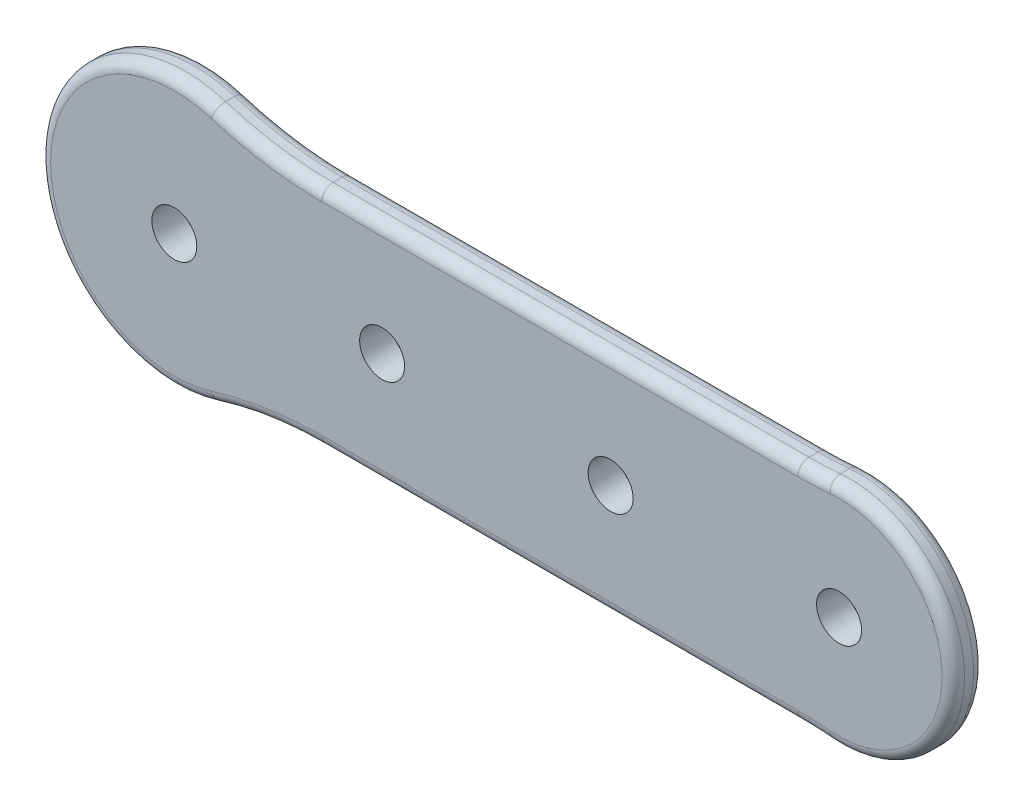
ISO-10303-21;
HEADER;
FILE_DESCRIPTION(('STEP AP214'),'2;1');
FILE_NAME('part.step','',(''),(''),'','','');
FILE_SCHEMA(('AUTOMOTIVE_DESIGN { 1 0 10303 214 1 1 1 1 }'));
ENDSEC;
DATA;
#1=APPLICATION_CONTEXT('core data for automotive mechanical design processes');
#2=APPLICATION_PROTOCOL_DEFINITION('international standard','automotive_design',2000,#1);
#3=PRODUCT_CONTEXT('',#1,'mechanical');
#4=PRODUCT('Part','Part','',(#3));
#5=PRODUCT_RELATED_PRODUCT_CATEGORY('part','',(#4));
#6=PRODUCT_DEFINITION_FORMATION('','',#4);
#7=PRODUCT_DEFINITION_CONTEXT('part definition',#1,'design');
#8=PRODUCT_DEFINITION('design','',#6,#7);
#9=PRODUCT_DEFINITION_SHAPE('','',#8);
#10=(LENGTH_UNIT() NAMED_UNIT(*) SI_UNIT(.MILLI.,.METRE.));
#11=(NAMED_UNIT(*) PLANE_ANGLE_UNIT() SI_UNIT($,.RADIAN.));
#12=(NAMED_UNIT(*) SI_UNIT($,.STERADIAN.) SOLID_ANGLE_UNIT());
#13=UNCERTAINTY_MEASURE_WITH_UNIT(LENGTH_MEASURE(1.E-05),#10,'distance_accuracy_value','');
#14=(GEOMETRIC_REPRESENTATION_CONTEXT(3) GLOBAL_UNCERTAINTY_ASSIGNED_CONTEXT((#13)) GLOBAL_UNIT_ASSIGNED_CONTEXT((#10,
#11,#12)) REPRESENTATION_CONTEXT('',''));
#15=CARTESIAN_POINT('',(0.,0.,0.));
#16=DIRECTION('',(0.,0.,1.));
#17=DIRECTION('',(1.,0.,0.));
#18=AXIS2_PLACEMENT_3D('',#15,#16,#17);
#19=CARTESIAN_POINT('',(-73.9,0.,7.));
#20=DIRECTION('',(0.,0.,-1.));
#21=DIRECTION('',(-1.,0.,0.));
#22=AXIS2_PLACEMENT_3D('',#19,#20,#21);
#23=CYLINDRICAL_SURFACE('',#22,30.);
#24=DIRECTION('',(0.,0.,-1.));
#25=VECTOR('',#24,1.);
#26=CARTESIAN_POINT('',(-64.9580383759518,-28.6363636363636,7.));
#27=LINE('',#26,#25);
#28=CARTESIAN_POINT('',(-64.9580383759518,-28.6363636363636,2.5));
#29=VERTEX_POINT('',#28);
#30=CARTESIAN_POINT('',(-64.9580383759518,-28.6363636363636,4.5));
#31=VERTEX_POINT('',#30);
#32=EDGE_CURVE('E191',#29,#31,#27,.F.);
#33=ORIENTED_EDGE('',*,*,#32,.T.);
#34=CARTESIAN_POINT('',(-73.9,0.,4.5));
#35=DIRECTION('',(0.,0.,1.));
#36=DIRECTION('',(1.,0.,0.));
#37=AXIS2_PLACEMENT_3D('',#34,#35,#36);
#38=CIRCLE('',#37,30.);
#39=CARTESIAN_POINT('',(-64.9580383759518,28.6363636363636,4.5));
#40=VERTEX_POINT('',#39);
#41=EDGE_CURVE('E228',#31,#40,#38,.F.);
#42=ORIENTED_EDGE('',*,*,#41,.T.);
#43=DIRECTION('',(0.,0.,-1.));
#44=VECTOR('',#43,1.);
#45=CARTESIAN_POINT('',(-64.9580383759518,28.6363636363636,7.));
#46=LINE('',#45,#44);
#47=CARTESIAN_POINT('',(-64.9580383759518,28.6363636363636,2.5));
#48=VERTEX_POINT('',#47);
#49=EDGE_CURVE('E196',#40,#48,#46,.T.);
#50=ORIENTED_EDGE('',*,*,#49,.T.);
#51=CARTESIAN_POINT('',(-73.9,0.,2.5));
#52=DIRECTION('',(0.,0.,1.));
#53=DIRECTION('',(1.,0.,0.));
#54=AXIS2_PLACEMENT_3D('',#51,#52,#53);
#55=CIRCLE('',#54,30.);
#56=EDGE_CURVE('E225',#48,#29,#55,.T.);
#57=ORIENTED_EDGE('',*,*,#56,.T.);
#58=EDGE_LOOP('',(#33,#42,#50,#57));
#59=FACE_BOUND('',#58,.T.);
#60=ADVANCED_FACE('F47',(#59),#23,.T.);
#61=CARTESIAN_POINT('',(0.,-25.,7.));
#62=DIRECTION('',(0.,1.,0.));
#63=DIRECTION('',(0.,0.,1.));
#64=AXIS2_PLACEMENT_3D('',#61,#62,#63);
#65=PLANE('',#64);
#66=DIRECTION('',(0.,0.,1.));
#67=VECTOR('',#66,1.);
#68=CARTESIAN_POINT('',(64.7261240470564,-25.,7.));
#69=LINE('',#68,#67);
#70=CARTESIAN_POINT('',(64.7261240470564,-25.,2.5));
#71=VERTEX_POINT('',#70);
#72=CARTESIAN_POINT('',(64.7261240470564,-25.,4.5));
#73=VERTEX_POINT('',#72);
#74=EDGE_CURVE('E356',#71,#73,#69,.T.);
#75=ORIENTED_EDGE('',*,*,#74,.T.);
#76=DIRECTION('',(1.,0.,0.));
#77=VECTOR('',#76,1.);
#78=CARTESIAN_POINT('',(-41.11280737849,-25.,4.5));
#79=LINE('',#78,#77);
#80=CARTESIAN_POINT('',(-41.11280737849,-25.,4.5));
#81=VERTEX_POINT('',#80);
#82=EDGE_CURVE('E240',#73,#81,#79,.F.);
#83=ORIENTED_EDGE('',*,*,#82,.T.);
#84=DIRECTION('',(0.,0.,1.));
#85=VECTOR('',#84,1.);
#86=CARTESIAN_POINT('',(-41.11280737849,-25.,0.));
#87=LINE('',#86,#85);
#88=CARTESIAN_POINT('',(-41.11280737849,-25.,2.5));
#89=VERTEX_POINT('',#88);
#90=EDGE_CURVE('E363',#81,#89,#87,.F.);
#91=ORIENTED_EDGE('',*,*,#90,.T.);
#92=DIRECTION('',(1.,0.,0.));
#93=VECTOR('',#92,1.);
#94=CARTESIAN_POINT('',(0.,-25.,2.5));
#95=LINE('',#94,#93);
#96=EDGE_CURVE('E237',#89,#71,#95,.T.);
#97=ORIENTED_EDGE('',*,*,#96,.T.);
#98=EDGE_LOOP('',(#75,#83,#91,#97));
#99=FACE_BOUND('',#98,.T.);
#100=ADVANCED_FACE('F429',(#99),#65,.F.);
#101=CARTESIAN_POINT('',(73.9,0.,7.));
#102=DIRECTION('',(0.,0.,-1.));
#103=DIRECTION('',(-1.,0.,0.));
#104=AXIS2_PLACEMENT_3D('',#101,#102,#103);
#105=CYLINDRICAL_SURFACE('',#104,25.4);
#106=DIRECTION('',(0.,0.,-1.));
#107=VECTOR('',#106,1.);
#108=CARTESIAN_POINT('',(71.6892177494804,25.303605313093,7.));
#109=LINE('',#108,#107);
#110=CARTESIAN_POINT('',(71.6892177494804,25.303605313093,2.5));
#111=VERTEX_POINT('',#110);
#112=CARTESIAN_POINT('',(71.6892177494804,25.303605313093,4.5));
#113=VERTEX_POINT('',#112);
#114=EDGE_CURVE('E364',#111,#113,#109,.F.);
#115=ORIENTED_EDGE('',*,*,#114,.T.);
#116=CARTESIAN_POINT('',(73.9,0.,4.5));
#117=DIRECTION('',(0.,0.,1.));
#118=DIRECTION('',(1.,0.,0.));
#119=AXIS2_PLACEMENT_3D('',#116,#117,#118);
#120=CIRCLE('',#119,25.4);
#121=CARTESIAN_POINT('',(71.6892177494804,-25.303605313093,4.5));
#122=VERTEX_POINT('',#121);
#123=EDGE_CURVE('E252',#113,#122,#120,.F.);
#124=ORIENTED_EDGE('',*,*,#123,.T.);
#125=DIRECTION('',(0.,0.,-1.));
#126=VECTOR('',#125,1.);
#127=CARTESIAN_POINT('',(71.6892177494804,-25.303605313093,7.));
#128=LINE('',#127,#126);
#129=CARTESIAN_POINT('',(71.6892177494804,-25.303605313093,2.5));
#130=VERTEX_POINT('',#129);
#131=EDGE_CURVE('E353',#122,#130,#128,.T.);
#132=ORIENTED_EDGE('',*,*,#131,.T.);
#133=CARTESIAN_POINT('',(73.9,0.,2.5));
#134=DIRECTION('',(0.,0.,1.));
#135=DIRECTION('',(1.,0.,0.));
#136=AXIS2_PLACEMENT_3D('',#133,#134,#135);
#137=CIRCLE('',#136,25.4);
#138=EDGE_CURVE('E249',#130,#111,#137,.T.);
#139=ORIENTED_EDGE('',*,*,#138,.T.);
#140=EDGE_LOOP('',(#115,#124,#132,#139));
#141=FACE_BOUND('',#140,.T.);
#142=ADVANCED_FACE('F359',(#141),#105,.T.);
#143=CARTESIAN_POINT('',(-27.7,0.,7.));
#144=DIRECTION('',(0.,0.,-1.));
#145=DIRECTION('',(-1.,0.,0.));
#146=AXIS2_PLACEMENT_3D('',#143,#144,#145);
#147=CYLINDRICAL_SURFACE('',#146,5.);
#148=CARTESIAN_POINT('',(-27.7,0.,7.));
#149=DIRECTION('',(0.,0.,1.));
#150=DIRECTION('',(1.,0.,0.));
#151=AXIS2_PLACEMENT_3D('',#148,#149,#150);
#152=CIRCLE('',#151,5.);
#153=CARTESIAN_POINT('',(-22.7,0.,7.));
#154=VERTEX_POINT('',#153);
#155=EDGE_CURVE('E721',#154,#154,#152,.T.);
#156=ORIENTED_EDGE('',*,*,#155,.T.);
#157=EDGE_LOOP('',(#156));
#158=FACE_BOUND('',#157,.T.);
#159=CARTESIAN_POINT('',(-27.7,0.,0.));
#160=DIRECTION('',(0.,0.,1.));
#161=DIRECTION('',(1.,0.,0.));
#162=AXIS2_PLACEMENT_3D('',#159,#160,#161);
#163=CIRCLE('',#162,5.);
#164=CARTESIAN_POINT('',(-22.7,0.,0.));
#165=VERTEX_POINT('',#164);
#166=EDGE_CURVE('E724',#165,#165,#163,.T.);
#167=ORIENTED_EDGE('',*,*,#166,.F.);
#168=EDGE_LOOP('',(#167));
#169=FACE_BOUND('',#168,.T.);
#170=ADVANCED_FACE('F657',(#158,#169),#147,.F.);
#171=CARTESIAN_POINT('',(-73.9,0.,7.));
#172=DIRECTION('',(0.,0.,-1.));
#173=DIRECTION('',(-1.,0.,0.));
#174=AXIS2_PLACEMENT_3D('',#171,#172,#173);
#175=CYLINDRICAL_SURFACE('',#174,5.);
#176=CARTESIAN_POINT('',(-73.9,0.,7.));
#177=DIRECTION('',(0.,0.,1.));
#178=DIRECTION('',(1.,0.,0.));
#179=AXIS2_PLACEMENT_3D('',#176,#177,#178);
#180=CIRCLE('',#179,5.);
#181=CARTESIAN_POINT('',(-68.9,0.,7.));
#182=VERTEX_POINT('',#181);
#183=EDGE_CURVE('E746',#182,#182,#180,.T.);
#184=ORIENTED_EDGE('',*,*,#183,.T.);
#185=EDGE_LOOP('',(#184));
#186=FACE_BOUND('',#185,.T.);
#187=CARTESIAN_POINT('',(-73.9,0.,0.));
#188=DIRECTION('',(0.,0.,1.));
#189=DIRECTION('',(1.,0.,0.));
#190=AXIS2_PLACEMENT_3D('',#187,#188,#189);
#191=CIRCLE('',#190,5.);
#192=CARTESIAN_POINT('',(-68.9,0.,0.));
#193=VERTEX_POINT('',#192);
#194=EDGE_CURVE('E728',#193,#193,#191,.T.);
#195=ORIENTED_EDGE('',*,*,#194,.F.);
#196=EDGE_LOOP('',(#195));
#197=FACE_BOUND('',#196,.T.);
#198=ADVANCED_FACE('F648',(#186,#197),#175,.F.);
#199=CARTESIAN_POINT('',(0.,25.,7.));
#200=DIRECTION('',(0.,1.,0.));
#201=DIRECTION('',(0.,0.,1.));
#202=AXIS2_PLACEMENT_3D('',#199,#200,#201);
#203=PLANE('',#202);
#204=DIRECTION('',(0.,0.,-1.));
#205=VECTOR('',#204,1.);
#206=CARTESIAN_POINT('',(-41.11280737849,25.,7.));
#207=LINE('',#206,#205);
#208=CARTESIAN_POINT('',(-41.11280737849,25.,2.5));
#209=VERTEX_POINT('',#208);
#210=CARTESIAN_POINT('',(-41.11280737849,25.,4.5));
#211=VERTEX_POINT('',#210);
#212=EDGE_CURVE('E377',#209,#211,#207,.F.);
#213=ORIENTED_EDGE('',*,*,#212,.T.);
#214=DIRECTION('',(1.,0.,0.));
#215=VECTOR('',#214,1.);
#216=CARTESIAN_POINT('',(0.,25.,4.5));
#217=LINE('',#216,#215);
#218=CARTESIAN_POINT('',(64.7261240470564,25.,4.5));
#219=VERTEX_POINT('',#218);
#220=EDGE_CURVE('E11',#211,#219,#217,.T.);
#221=ORIENTED_EDGE('',*,*,#220,.T.);
#222=DIRECTION('',(0.,0.,-1.));
#223=VECTOR('',#222,1.);
#224=CARTESIAN_POINT('',(64.7261240470564,25.,7.));
#225=LINE('',#224,#223);
#226=CARTESIAN_POINT('',(64.7261240470564,25.,2.5));
#227=VERTEX_POINT('',#226);
#228=EDGE_CURVE('E381',#219,#227,#225,.T.);
#229=ORIENTED_EDGE('',*,*,#228,.T.);
#230=DIRECTION('',(1.,0.,0.));
#231=VECTOR('',#230,1.);
#232=CARTESIAN_POINT('',(-41.11280737849,25.,2.5));
#233=LINE('',#232,#231);
#234=EDGE_CURVE('E57',#227,#209,#233,.F.);
#235=ORIENTED_EDGE('',*,*,#234,.T.);
#236=EDGE_LOOP('',(#213,#221,#229,#235));
#237=FACE_BOUND('',#236,.T.);
#238=ADVANCED_FACE('F443',(#237),#203,.T.);
#239=CARTESIAN_POINT('',(73.9,0.,7.));
#240=DIRECTION('',(0.,0.,-1.));
#241=DIRECTION('',(-1.,0.,0.));
#242=AXIS2_PLACEMENT_3D('',#239,#240,#241);
#243=CYLINDRICAL_SURFACE('',#242,5.);
#244=CARTESIAN_POINT('',(73.9,0.,7.));
#245=DIRECTION('',(0.,0.,1.));
#246=DIRECTION('',(1.,0.,0.));
#247=AXIS2_PLACEMENT_3D('',#244,#245,#246);
#248=CIRCLE('',#247,5.);
#249=CARTESIAN_POINT('',(78.9,0.,7.));
#250=VERTEX_POINT('',#249);
#251=EDGE_CURVE('E734',#250,#250,#248,.T.);
#252=ORIENTED_EDGE('',*,*,#251,.T.);
#253=EDGE_LOOP('',(#252));
#254=FACE_BOUND('',#253,.T.);
#255=CARTESIAN_POINT('',(73.9,0.,0.));
#256=DIRECTION('',(0.,0.,1.));
#257=DIRECTION('',(1.,0.,0.));
#258=AXIS2_PLACEMENT_3D('',#255,#256,#257);
#259=CIRCLE('',#258,5.);
#260=CARTESIAN_POINT('',(78.9,0.,0.));
#261=VERTEX_POINT('',#260);
#262=EDGE_CURVE('E306',#261,#261,#259,.T.);
#263=ORIENTED_EDGE('',*,*,#262,.F.);
#264=EDGE_LOOP('',(#263));
#265=FACE_BOUND('',#264,.T.);
#266=ADVANCED_FACE('F439',(#254,#265),#243,.F.);
#267=CARTESIAN_POINT('',(23.1,0.,7.));
#268=DIRECTION('',(0.,0.,-1.));
#269=DIRECTION('',(-1.,0.,0.));
#270=AXIS2_PLACEMENT_3D('',#267,#268,#269);
#271=CYLINDRICAL_SURFACE('',#270,5.);
#272=CARTESIAN_POINT('',(23.1,0.,7.));
#273=DIRECTION('',(0.,0.,1.));
#274=DIRECTION('',(1.,0.,0.));
#275=AXIS2_PLACEMENT_3D('',#272,#273,#274);
#276=CIRCLE('',#275,5.);
#277=CARTESIAN_POINT('',(28.1,0.,7.));
#278=VERTEX_POINT('',#277);
#279=EDGE_CURVE('E371',#278,#278,#276,.T.);
#280=ORIENTED_EDGE('',*,*,#279,.T.);
#281=EDGE_LOOP('',(#280));
#282=FACE_BOUND('',#281,.T.);
#283=CARTESIAN_POINT('',(23.1,0.,0.));
#284=DIRECTION('',(0.,0.,1.));
#285=DIRECTION('',(1.,0.,0.));
#286=AXIS2_PLACEMENT_3D('',#283,#284,#285);
#287=CIRCLE('',#286,5.);
#288=CARTESIAN_POINT('',(28.1,0.,0.));
#289=VERTEX_POINT('',#288);
#290=EDGE_CURVE('E727',#289,#289,#287,.T.);
#291=ORIENTED_EDGE('',*,*,#290,.F.);
#292=EDGE_LOOP('',(#291));
#293=FACE_BOUND('',#292,.T.);
#294=ADVANCED_FACE('F442',(#282,#293),#271,.F.);
#295=CARTESIAN_POINT('',(0.,0.,7.));
#296=DIRECTION('',(0.,0.,1.));
#297=DIRECTION('',(1.,0.,0.));
#298=AXIS2_PLACEMENT_3D('',#295,#296,#297);
#299=PLANE('',#298);
#300=DIRECTION('',(1.,0.,0.));
#301=VECTOR('',#300,1.);
#302=CARTESIAN_POINT('',(0.,22.5,7.));
#303=LINE('',#302,#301);
#304=CARTESIAN_POINT('',(64.7261240470564,22.5,7.));
#305=VERTEX_POINT('',#304);
#306=CARTESIAN_POINT('',(-41.11280737849,22.5,7.));
#307=VERTEX_POINT('',#306);
#308=EDGE_CURVE('E167',#305,#307,#303,.F.);
#309=ORIENTED_EDGE('',*,*,#308,.T.);
#310=CARTESIAN_POINT('',(-41.11280737849,105.,7.));
#311=DIRECTION('',(0.,0.,1.));
#312=DIRECTION('',(1.,0.,0.));
#313=AXIS2_PLACEMENT_3D('',#310,#311,#312);
#314=CIRCLE('',#313,82.5);
#315=CARTESIAN_POINT('',(-65.7032018446225,26.25,7.));
#316=VERTEX_POINT('',#315);
#317=EDGE_CURVE('E214',#307,#316,#314,.F.);
#318=ORIENTED_EDGE('',*,*,#317,.T.);
#319=CARTESIAN_POINT('',(-73.9,0.,7.));
#320=DIRECTION('',(0.,0.,1.));
#321=DIRECTION('',(1.,0.,0.));
#322=AXIS2_PLACEMENT_3D('',#319,#320,#321);
#323=CIRCLE('',#322,27.5);
#324=CARTESIAN_POINT('',(-65.7032018446225,-26.25,7.));
#325=VERTEX_POINT('',#324);
#326=EDGE_CURVE('E211',#316,#325,#323,.T.);
#327=ORIENTED_EDGE('',*,*,#326,.T.);
#328=CARTESIAN_POINT('',(-41.11280737849,-105.,7.));
#329=DIRECTION('',(0.,0.,1.));
#330=DIRECTION('',(1.,0.,0.));
#331=AXIS2_PLACEMENT_3D('',#328,#329,#330);
#332=CIRCLE('',#331,82.5);
#333=CARTESIAN_POINT('',(-41.11280737849,-22.5,7.));
#334=VERTEX_POINT('',#333);
#335=EDGE_CURVE('E208',#325,#334,#332,.F.);
#336=ORIENTED_EDGE('',*,*,#335,.T.);
#337=DIRECTION('',(1.,0.,0.));
#338=VECTOR('',#337,1.);
#339=CARTESIAN_POINT('',(64.7261240470564,-22.5,7.));
#340=LINE('',#339,#338);
#341=CARTESIAN_POINT('',(64.7261240470564,-22.5,7.));
#342=VERTEX_POINT('',#341);
#343=EDGE_CURVE('E205',#334,#342,#340,.T.);
#344=ORIENTED_EDGE('',*,*,#343,.T.);
#345=CARTESIAN_POINT('',(64.7261240470564,-105.,7.));
#346=DIRECTION('',(0.,0.,1.));
#347=DIRECTION('',(1.,0.,0.));
#348=AXIS2_PLACEMENT_3D('',#345,#346,#347);
#349=CIRCLE('',#348,82.5);
#350=CARTESIAN_POINT('',(71.9068144276811,-22.8130929791271,7.));
#351=VERTEX_POINT('',#350);
#352=EDGE_CURVE('E202',#342,#351,#349,.F.);
#353=ORIENTED_EDGE('',*,*,#352,.T.);
#354=CARTESIAN_POINT('',(73.9,0.,7.));
#355=DIRECTION('',(0.,0.,1.));
#356=DIRECTION('',(1.,0.,0.));
#357=AXIS2_PLACEMENT_3D('',#354,#355,#356);
#358=CIRCLE('',#357,22.9);
#359=CARTESIAN_POINT('',(71.9068144276811,22.8130929791271,7.));
#360=VERTEX_POINT('',#359);
#361=EDGE_CURVE('E170',#351,#360,#358,.T.);
#362=ORIENTED_EDGE('',*,*,#361,.T.);
#363=CARTESIAN_POINT('',(64.7261240470564,105.,7.));
#364=DIRECTION('',(0.,0.,1.));
#365=DIRECTION('',(1.,0.,0.));
#366=AXIS2_PLACEMENT_3D('',#363,#364,#365);
#367=CIRCLE('',#366,82.5);
#368=EDGE_CURVE('E161',#360,#305,#367,.F.);
#369=ORIENTED_EDGE('',*,*,#368,.T.);
#370=EDGE_LOOP('',(#309,#318,#327,#336,#344,#353,#362,#369));
#371=FACE_BOUND('',#370,.T.);
#372=ORIENTED_EDGE('',*,*,#251,.F.);
#373=EDGE_LOOP('',(#372));
#374=FACE_BOUND('',#373,.T.);
#375=ORIENTED_EDGE('',*,*,#183,.F.);
#376=EDGE_LOOP('',(#375));
#377=FACE_BOUND('',#376,.T.);
#378=ORIENTED_EDGE('',*,*,#155,.F.);
#379=EDGE_LOOP('',(#378));
#380=FACE_BOUND('',#379,.T.);
#381=ORIENTED_EDGE('',*,*,#279,.F.);
#382=EDGE_LOOP('',(#381));
#383=FACE_BOUND('',#382,.T.);
#384=ADVANCED_FACE('F163',(#371,#374,#377,#380,#383),#299,.T.);
#385=CARTESIAN_POINT('',(0.,0.,0.));
#386=DIRECTION('',(0.,0.,1.));
#387=DIRECTION('',(1.,0.,0.));
#388=AXIS2_PLACEMENT_3D('',#385,#386,#387);
#389=PLANE('',#388);
#390=CARTESIAN_POINT('',(-73.9,0.,0.));
#391=DIRECTION('',(0.,0.,1.));
#392=DIRECTION('',(1.,0.,0.));
#393=AXIS2_PLACEMENT_3D('',#390,#391,#392);
#394=CIRCLE('',#393,27.5);
#395=CARTESIAN_POINT('',(-65.7032018446225,-26.25,0.));
#396=VERTEX_POINT('',#395);
#397=CARTESIAN_POINT('',(-65.7032018446225,26.25,0.));
#398=VERTEX_POINT('',#397);
#399=EDGE_CURVE('E65',#396,#398,#394,.F.);
#400=ORIENTED_EDGE('',*,*,#399,.T.);
#401=CARTESIAN_POINT('',(-41.11280737849,105.,0.));
#402=DIRECTION('',(0.,0.,1.));
#403=DIRECTION('',(1.,0.,0.));
#404=AXIS2_PLACEMENT_3D('',#401,#402,#403);
#405=CIRCLE('',#404,82.5);
#406=CARTESIAN_POINT('',(-41.11280737849,22.5,0.));
#407=VERTEX_POINT('',#406);
#408=EDGE_CURVE('E279',#398,#407,#405,.T.);
#409=ORIENTED_EDGE('',*,*,#408,.T.);
#410=DIRECTION('',(1.,0.,0.));
#411=VECTOR('',#410,1.);
#412=CARTESIAN_POINT('',(64.7261240470564,22.5,0.));
#413=LINE('',#412,#411);
#414=CARTESIAN_POINT('',(64.7261240470564,22.5,0.));
#415=VERTEX_POINT('',#414);
#416=EDGE_CURVE('E260',#407,#415,#413,.T.);
#417=ORIENTED_EDGE('',*,*,#416,.T.);
#418=CARTESIAN_POINT('',(64.7261240470564,105.,0.));
#419=DIRECTION('',(0.,0.,1.));
#420=DIRECTION('',(1.,0.,0.));
#421=AXIS2_PLACEMENT_3D('',#418,#419,#420);
#422=CIRCLE('',#421,82.5);
#423=CARTESIAN_POINT('',(71.9068144276811,22.8130929791271,0.));
#424=VERTEX_POINT('',#423);
#425=EDGE_CURVE('E263',#415,#424,#422,.T.);
#426=ORIENTED_EDGE('',*,*,#425,.T.);
#427=CARTESIAN_POINT('',(73.9,0.,0.));
#428=DIRECTION('',(0.,0.,1.));
#429=DIRECTION('',(1.,0.,0.));
#430=AXIS2_PLACEMENT_3D('',#427,#428,#429);
#431=CIRCLE('',#430,22.9);
#432=CARTESIAN_POINT('',(71.9068144276811,-22.8130929791271,0.));
#433=VERTEX_POINT('',#432);
#434=EDGE_CURVE('E266',#424,#433,#431,.F.);
#435=ORIENTED_EDGE('',*,*,#434,.T.);
#436=CARTESIAN_POINT('',(64.7261240470564,-105.,0.));
#437=DIRECTION('',(0.,0.,1.));
#438=DIRECTION('',(1.,0.,0.));
#439=AXIS2_PLACEMENT_3D('',#436,#437,#438);
#440=CIRCLE('',#439,82.5);
#441=CARTESIAN_POINT('',(64.7261240470564,-22.5,0.));
#442=VERTEX_POINT('',#441);
#443=EDGE_CURVE('E269',#433,#442,#440,.T.);
#444=ORIENTED_EDGE('',*,*,#443,.T.);
#445=DIRECTION('',(1.,0.,0.));
#446=VECTOR('',#445,1.);
#447=CARTESIAN_POINT('',(0.,-22.5,0.));
#448=LINE('',#447,#446);
#449=CARTESIAN_POINT('',(-41.11280737849,-22.5,0.));
#450=VERTEX_POINT('',#449);
#451=EDGE_CURVE('E272',#442,#450,#448,.F.);
#452=ORIENTED_EDGE('',*,*,#451,.T.);
#453=CARTESIAN_POINT('',(-41.11280737849,-105.,0.));
#454=DIRECTION('',(0.,0.,1.));
#455=DIRECTION('',(1.,0.,0.));
#456=AXIS2_PLACEMENT_3D('',#453,#454,#455);
#457=CIRCLE('',#456,82.5);
#458=EDGE_CURVE('E70',#450,#396,#457,.T.);
#459=ORIENTED_EDGE('',*,*,#458,.T.);
#460=EDGE_LOOP('',(#400,#409,#417,#426,#435,#444,#452,#459));
#461=FACE_BOUND('',#460,.T.);
#462=ORIENTED_EDGE('',*,*,#262,.T.);
#463=EDGE_LOOP('',(#462));
#464=FACE_BOUND('',#463,.T.);
#465=ORIENTED_EDGE('',*,*,#194,.T.);
#466=EDGE_LOOP('',(#465));
#467=FACE_BOUND('',#466,.T.);
#468=ORIENTED_EDGE('',*,*,#166,.T.);
#469=EDGE_LOOP('',(#468));
#470=FACE_BOUND('',#469,.T.);
#471=ORIENTED_EDGE('',*,*,#290,.T.);
#472=EDGE_LOOP('',(#471));
#473=FACE_BOUND('',#472,.T.);
#474=ADVANCED_FACE('F448',(#461,#464,#467,#470,#473),#389,.F.);
#475=CARTESIAN_POINT('',(64.7261240470564,-105.,7.));
#476=DIRECTION('',(0.,0.,-1.));
#477=DIRECTION('',(-1.,0.,0.));
#478=AXIS2_PLACEMENT_3D('',#475,#476,#477);
#479=CYLINDRICAL_SURFACE('',#478,80.);
#480=ORIENTED_EDGE('',*,*,#131,.F.);
#481=CARTESIAN_POINT('',(64.7261240470564,-105.,4.5));
#482=DIRECTION('',(0.,0.,1.));
#483=DIRECTION('',(1.,0.,0.));
#484=AXIS2_PLACEMENT_3D('',#481,#482,#483);
#485=CIRCLE('',#484,80.);
#486=EDGE_CURVE('E246',#122,#73,#485,.T.);
#487=ORIENTED_EDGE('',*,*,#486,.T.);
#488=ORIENTED_EDGE('',*,*,#74,.F.);
#489=CARTESIAN_POINT('',(64.7261240470564,-105.,2.5));
#490=DIRECTION('',(0.,0.,1.));
#491=DIRECTION('',(1.,0.,0.));
#492=AXIS2_PLACEMENT_3D('',#489,#490,#491);
#493=CIRCLE('',#492,80.);
#494=EDGE_CURVE('E243',#71,#130,#493,.F.);
#495=ORIENTED_EDGE('',*,*,#494,.T.);
#496=EDGE_LOOP('',(#480,#487,#488,#495));
#497=FACE_BOUND('',#496,.T.);
#498=ADVANCED_FACE('F352',(#497),#479,.F.);
#499=CARTESIAN_POINT('',(64.7261240470564,105.,7.));
#500=DIRECTION('',(0.,0.,-1.));
#501=DIRECTION('',(-1.,0.,0.));
#502=AXIS2_PLACEMENT_3D('',#499,#500,#501);
#503=CYLINDRICAL_SURFACE('',#502,80.);
#504=ORIENTED_EDGE('',*,*,#228,.F.);
#505=CARTESIAN_POINT('',(64.7261240470564,105.,4.5));
#506=DIRECTION('',(0.,0.,1.));
#507=DIRECTION('',(1.,0.,0.));
#508=AXIS2_PLACEMENT_3D('',#505,#506,#507);
#509=CIRCLE('',#508,80.);
#510=EDGE_CURVE('E180',#219,#113,#509,.T.);
#511=ORIENTED_EDGE('',*,*,#510,.T.);
#512=ORIENTED_EDGE('',*,*,#114,.F.);
#513=CARTESIAN_POINT('',(64.7261240470564,105.,2.5));
#514=DIRECTION('',(0.,0.,1.));
#515=DIRECTION('',(1.,0.,0.));
#516=AXIS2_PLACEMENT_3D('',#513,#514,#515);
#517=CIRCLE('',#516,80.);
#518=EDGE_CURVE('E255',#111,#227,#517,.F.);
#519=ORIENTED_EDGE('',*,*,#518,.T.);
#520=EDGE_LOOP('',(#504,#511,#512,#519));
#521=FACE_BOUND('',#520,.T.);
#522=ADVANCED_FACE('F447',(#521),#503,.F.);
#523=CARTESIAN_POINT('',(-41.11280737849,-105.,7.));
#524=DIRECTION('',(0.,0.,-1.));
#525=DIRECTION('',(-1.,0.,0.));
#526=AXIS2_PLACEMENT_3D('',#523,#524,#525);
#527=CYLINDRICAL_SURFACE('',#526,80.);
#528=ORIENTED_EDGE('',*,*,#90,.F.);
#529=CARTESIAN_POINT('',(-41.11280737849,-105.,4.5));
#530=DIRECTION('',(0.,0.,1.));
#531=DIRECTION('',(1.,0.,0.));
#532=AXIS2_PLACEMENT_3D('',#529,#530,#531);
#533=CIRCLE('',#532,80.);
#534=EDGE_CURVE('E234',#81,#31,#533,.T.);
#535=ORIENTED_EDGE('',*,*,#534,.T.);
#536=ORIENTED_EDGE('',*,*,#32,.F.);
#537=CARTESIAN_POINT('',(-41.11280737849,-105.,2.5));
#538=DIRECTION('',(0.,0.,1.));
#539=DIRECTION('',(1.,0.,0.));
#540=AXIS2_PLACEMENT_3D('',#537,#538,#539);
#541=CIRCLE('',#540,80.);
#542=EDGE_CURVE('E231',#29,#89,#541,.F.);
#543=ORIENTED_EDGE('',*,*,#542,.T.);
#544=EDGE_LOOP('',(#528,#535,#536,#543));
#545=FACE_BOUND('',#544,.T.);
#546=ADVANCED_FACE('F451',(#545),#527,.F.);
#547=CARTESIAN_POINT('',(-41.11280737849,105.,7.));
#548=DIRECTION('',(0.,0.,-1.));
#549=DIRECTION('',(-1.,0.,0.));
#550=AXIS2_PLACEMENT_3D('',#547,#548,#549);
#551=CYLINDRICAL_SURFACE('',#550,80.);
#552=ORIENTED_EDGE('',*,*,#49,.F.);
#553=CARTESIAN_POINT('',(-41.11280737849,105.,4.5));
#554=DIRECTION('',(0.,0.,1.));
#555=DIRECTION('',(1.,0.,0.));
#556=AXIS2_PLACEMENT_3D('',#553,#554,#555);
#557=CIRCLE('',#556,80.);
#558=EDGE_CURVE('E221',#40,#211,#557,.T.);
#559=ORIENTED_EDGE('',*,*,#558,.T.);
#560=ORIENTED_EDGE('',*,*,#212,.F.);
#561=CARTESIAN_POINT('',(-41.11280737849,105.,2.5));
#562=DIRECTION('',(0.,0.,1.));
#563=DIRECTION('',(1.,0.,0.));
#564=AXIS2_PLACEMENT_3D('',#561,#562,#563);
#565=CIRCLE('',#564,80.);
#566=EDGE_CURVE('E217',#209,#48,#565,.F.);
#567=ORIENTED_EDGE('',*,*,#566,.T.);
#568=EDGE_LOOP('',(#552,#559,#560,#567));
#569=FACE_BOUND('',#568,.T.);
#570=ADVANCED_FACE('F394',(#569),#551,.F.);
#571=CARTESIAN_POINT('',(64.7261240470564,-105.,4.5));
#572=DIRECTION('',(0.,0.,1.));
#573=DIRECTION('',(1.,0.,0.));
#574=AXIS2_PLACEMENT_3D('',#571,#572,#573);
#575=TOROIDAL_SURFACE('',#574,82.5,2.5);
#576=CARTESIAN_POINT('',(64.7261240470564,-22.5,4.5));
#577=DIRECTION('',(-1.,0.,0.));
#578=DIRECTION('',(0.,0.,1.));
#579=AXIS2_PLACEMENT_3D('',#576,#577,#578);
#580=CIRCLE('',#579,2.5);
#581=EDGE_CURVE('E298',#73,#342,#580,.T.);
#582=ORIENTED_EDGE('',*,*,#581,.F.);
#583=ORIENTED_EDGE('',*,*,#486,.F.);
#584=CARTESIAN_POINT('',(71.9068144276811,-22.8130929791271,4.5));
#585=DIRECTION('',(0.996204933586338,-0.0870386712802984,0.));
#586=DIRECTION('',(0.0870386712802984,0.996204933586338,0.));
#587=AXIS2_PLACEMENT_3D('',#584,#585,#586);
#588=CIRCLE('',#587,2.5);
#589=EDGE_CURVE('E302',#351,#122,#588,.T.);
#590=ORIENTED_EDGE('',*,*,#589,.F.);
#591=ORIENTED_EDGE('',*,*,#352,.F.);
#592=EDGE_LOOP('',(#582,#583,#590,#591));
#593=FACE_BOUND('',#592,.T.);
#594=ADVANCED_FACE('F417',(#593),#575,.T.);
#595=CARTESIAN_POINT('',(73.9,0.,4.5));
#596=DIRECTION('',(0.,0.,1.));
#597=DIRECTION('',(1.,0.,0.));
#598=AXIS2_PLACEMENT_3D('',#595,#596,#597);
#599=TOROIDAL_SURFACE('',#598,22.9,2.5);
#600=ORIENTED_EDGE('',*,*,#589,.T.);
#601=ORIENTED_EDGE('',*,*,#123,.F.);
#602=CARTESIAN_POINT('',(71.9068144276811,22.8130929791271,4.5));
#603=DIRECTION('',(-0.996204933586338,-0.0870386712802984,0.));
#604=DIRECTION('',(0.0870386712802984,-0.996204933586338,0.));
#605=AXIS2_PLACEMENT_3D('',#602,#603,#604);
#606=CIRCLE('',#605,2.5);
#607=EDGE_CURVE('E295',#360,#113,#606,.T.);
#608=ORIENTED_EDGE('',*,*,#607,.F.);
#609=ORIENTED_EDGE('',*,*,#361,.F.);
#610=EDGE_LOOP('',(#600,#601,#608,#609));
#611=FACE_BOUND('',#610,.T.);
#612=ADVANCED_FACE('F419',(#611),#599,.T.);
#613=CARTESIAN_POINT('',(0.,-22.5,4.5));
#614=DIRECTION('',(-1.,0.,0.));
#615=DIRECTION('',(0.,0.,1.));
#616=AXIS2_PLACEMENT_3D('',#613,#614,#615);
#617=CYLINDRICAL_SURFACE('',#616,2.5);
#618=ORIENTED_EDGE('',*,*,#581,.T.);
#619=ORIENTED_EDGE('',*,*,#343,.F.);
#620=CARTESIAN_POINT('',(-41.11280737849,-22.5,4.5));
#621=DIRECTION('',(-1.,0.,0.));
#622=DIRECTION('',(0.,0.,1.));
#623=AXIS2_PLACEMENT_3D('',#620,#621,#622);
#624=CIRCLE('',#623,2.5);
#625=EDGE_CURVE('E184',#81,#334,#624,.T.);
#626=ORIENTED_EDGE('',*,*,#625,.F.);
#627=ORIENTED_EDGE('',*,*,#82,.F.);
#628=EDGE_LOOP('',(#618,#619,#626,#627));
#629=FACE_BOUND('',#628,.T.);
#630=ADVANCED_FACE('F412',(#629),#617,.T.);
#631=CARTESIAN_POINT('',(64.7261240470564,105.,4.5));
#632=DIRECTION('',(0.,0.,1.));
#633=DIRECTION('',(1.,0.,0.));
#634=AXIS2_PLACEMENT_3D('',#631,#632,#633);
#635=TOROIDAL_SURFACE('',#634,82.5,2.5);
#636=ORIENTED_EDGE('',*,*,#607,.T.);
#637=ORIENTED_EDGE('',*,*,#510,.F.);
#638=CARTESIAN_POINT('',(64.7261240470564,22.5,4.5));
#639=DIRECTION('',(-1.,0.,0.));
#640=DIRECTION('',(0.,0.,1.));
#641=AXIS2_PLACEMENT_3D('',#638,#639,#640);
#642=CIRCLE('',#641,2.5);
#643=EDGE_CURVE('E178',#305,#219,#642,.T.);
#644=ORIENTED_EDGE('',*,*,#643,.F.);
#645=ORIENTED_EDGE('',*,*,#368,.F.);
#646=EDGE_LOOP('',(#636,#637,#644,#645));
#647=FACE_BOUND('',#646,.T.);
#648=ADVANCED_FACE('F179',(#647),#635,.T.);
#649=CARTESIAN_POINT('',(-41.11280737849,-105.,4.5));
#650=DIRECTION('',(0.,0.,1.));
#651=DIRECTION('',(1.,0.,0.));
#652=AXIS2_PLACEMENT_3D('',#649,#650,#651);
#653=TOROIDAL_SURFACE('',#652,82.5,2.5);
#654=ORIENTED_EDGE('',*,*,#625,.T.);
#655=ORIENTED_EDGE('',*,*,#335,.F.);
#656=CARTESIAN_POINT('',(-65.7032018446225,-26.25,4.5));
#657=DIRECTION('',(-0.954545454545455,-0.298065387468271,0.));
#658=DIRECTION('',(0.298065387468271,-0.954545454545455,0.));
#659=AXIS2_PLACEMENT_3D('',#656,#657,#658);
#660=CIRCLE('',#659,2.5);
#661=EDGE_CURVE('E185',#31,#325,#660,.T.);
#662=ORIENTED_EDGE('',*,*,#661,.F.);
#663=ORIENTED_EDGE('',*,*,#534,.F.);
#664=EDGE_LOOP('',(#654,#655,#662,#663));
#665=FACE_BOUND('',#664,.T.);
#666=ADVANCED_FACE('F407',(#665),#653,.T.);
#667=CARTESIAN_POINT('',(0.,22.5,4.5));
#668=DIRECTION('',(1.,0.,0.));
#669=DIRECTION('',(0.,0.,-1.));
#670=AXIS2_PLACEMENT_3D('',#667,#668,#669);
#671=CYLINDRICAL_SURFACE('',#670,2.5);
#672=ORIENTED_EDGE('',*,*,#643,.T.);
#673=ORIENTED_EDGE('',*,*,#220,.F.);
#674=CARTESIAN_POINT('',(-41.11280737849,22.5,4.5));
#675=DIRECTION('',(-1.,0.,0.));
#676=DIRECTION('',(0.,0.,1.));
#677=AXIS2_PLACEMENT_3D('',#674,#675,#676);
#678=CIRCLE('',#677,2.5);
#679=EDGE_CURVE('E188',#307,#211,#678,.T.);
#680=ORIENTED_EDGE('',*,*,#679,.F.);
#681=ORIENTED_EDGE('',*,*,#308,.F.);
#682=EDGE_LOOP('',(#672,#673,#680,#681));
#683=FACE_BOUND('',#682,.T.);
#684=ADVANCED_FACE('F187',(#683),#671,.T.);
#685=CARTESIAN_POINT('',(-73.9,0.,4.5));
#686=DIRECTION('',(0.,0.,1.));
#687=DIRECTION('',(1.,0.,0.));
#688=AXIS2_PLACEMENT_3D('',#685,#686,#687);
#689=TOROIDAL_SURFACE('',#688,27.5,2.5);
#690=ORIENTED_EDGE('',*,*,#661,.T.);
#691=ORIENTED_EDGE('',*,*,#326,.F.);
#692=CARTESIAN_POINT('',(-65.7032018446225,26.25,4.5));
#693=DIRECTION('',(0.954545454545455,-0.298065387468271,0.));
#694=DIRECTION('',(0.298065387468271,0.954545454545455,0.));
#695=AXIS2_PLACEMENT_3D('',#692,#693,#694);
#696=CIRCLE('',#695,2.5);
#697=EDGE_CURVE('E284',#40,#316,#696,.T.);
#698=ORIENTED_EDGE('',*,*,#697,.F.);
#699=ORIENTED_EDGE('',*,*,#41,.F.);
#700=EDGE_LOOP('',(#690,#691,#698,#699));
#701=FACE_BOUND('',#700,.T.);
#702=ADVANCED_FACE('F402',(#701),#689,.T.);
#703=CARTESIAN_POINT('',(-41.11280737849,105.,4.5));
#704=DIRECTION('',(0.,0.,1.));
#705=DIRECTION('',(1.,0.,0.));
#706=AXIS2_PLACEMENT_3D('',#703,#704,#705);
#707=TOROIDAL_SURFACE('',#706,82.5,2.5);
#708=ORIENTED_EDGE('',*,*,#679,.T.);
#709=ORIENTED_EDGE('',*,*,#558,.F.);
#710=ORIENTED_EDGE('',*,*,#697,.T.);
#711=ORIENTED_EDGE('',*,*,#317,.F.);
#712=EDGE_LOOP('',(#708,#709,#710,#711));
#713=FACE_BOUND('',#712,.T.);
#714=ADVANCED_FACE('F399',(#713),#707,.T.);
#715=CARTESIAN_POINT('',(64.7261240470564,-105.,2.5));
#716=DIRECTION('',(0.,0.,1.));
#717=DIRECTION('',(1.,0.,0.));
#718=AXIS2_PLACEMENT_3D('',#715,#716,#717);
#719=TOROIDAL_SURFACE('',#718,82.5,2.5);
#720=CARTESIAN_POINT('',(71.9068144276811,-22.8130929791271,2.5));
#721=DIRECTION('',(0.996204933586338,-0.0870386712802984,0.));
#722=DIRECTION('',(0.0870386712802984,0.996204933586338,0.));
#723=AXIS2_PLACEMENT_3D('',#720,#721,#722);
#724=CIRCLE('',#723,2.5);
#725=EDGE_CURVE('E328',#130,#433,#724,.T.);
#726=ORIENTED_EDGE('',*,*,#725,.F.);
#727=ORIENTED_EDGE('',*,*,#494,.F.);
#728=CARTESIAN_POINT('',(64.7261240470564,-22.5,2.5));
#729=DIRECTION('',(-1.,0.,0.));
#730=DIRECTION('',(0.,0.,1.));
#731=AXIS2_PLACEMENT_3D('',#728,#729,#730);
#732=CIRCLE('',#731,2.5);
#733=EDGE_CURVE('E51',#442,#71,#732,.T.);
#734=ORIENTED_EDGE('',*,*,#733,.F.);
#735=ORIENTED_EDGE('',*,*,#443,.F.);
#736=EDGE_LOOP('',(#726,#727,#734,#735));
#737=FACE_BOUND('',#736,.T.);
#738=ADVANCED_FACE('F49',(#737),#719,.T.);
#739=CARTESIAN_POINT('',(0.,-22.5,2.5));
#740=DIRECTION('',(1.,0.,0.));
#741=DIRECTION('',(0.,0.,-1.));
#742=AXIS2_PLACEMENT_3D('',#739,#740,#741);
#743=CYLINDRICAL_SURFACE('',#742,2.5);
#744=ORIENTED_EDGE('',*,*,#733,.T.);
#745=ORIENTED_EDGE('',*,*,#96,.F.);
#746=CARTESIAN_POINT('',(-41.11280737849,-22.5,2.5));
#747=DIRECTION('',(-1.,0.,0.));
#748=DIRECTION('',(0.,0.,1.));
#749=AXIS2_PLACEMENT_3D('',#746,#747,#748);
#750=CIRCLE('',#749,2.5);
#751=EDGE_CURVE('E325',#450,#89,#750,.T.);
#752=ORIENTED_EDGE('',*,*,#751,.F.);
#753=ORIENTED_EDGE('',*,*,#451,.F.);
#754=EDGE_LOOP('',(#744,#745,#752,#753));
#755=FACE_BOUND('',#754,.T.);
#756=ADVANCED_FACE('F343',(#755),#743,.T.);
#757=CARTESIAN_POINT('',(73.9,0.,2.5));
#758=DIRECTION('',(0.,0.,1.));
#759=DIRECTION('',(1.,0.,0.));
#760=AXIS2_PLACEMENT_3D('',#757,#758,#759);
#761=TOROIDAL_SURFACE('',#760,22.9,2.5);
#762=ORIENTED_EDGE('',*,*,#725,.T.);
#763=ORIENTED_EDGE('',*,*,#434,.F.);
#764=CARTESIAN_POINT('',(71.9068144276811,22.8130929791271,2.5));
#765=DIRECTION('',(-0.996204933586338,-0.0870386712802984,0.));
#766=DIRECTION('',(0.0870386712802984,-0.996204933586338,0.));
#767=AXIS2_PLACEMENT_3D('',#764,#765,#766);
#768=CIRCLE('',#767,2.5);
#769=EDGE_CURVE('E321',#111,#424,#768,.T.);
#770=ORIENTED_EDGE('',*,*,#769,.F.);
#771=ORIENTED_EDGE('',*,*,#138,.F.);
#772=EDGE_LOOP('',(#762,#763,#770,#771));
#773=FACE_BOUND('',#772,.T.);
#774=ADVANCED_FACE('F504',(#773),#761,.T.);
#775=CARTESIAN_POINT('',(-41.11280737849,-105.,2.5));
#776=DIRECTION('',(0.,0.,1.));
#777=DIRECTION('',(1.,0.,0.));
#778=AXIS2_PLACEMENT_3D('',#775,#776,#777);
#779=TOROIDAL_SURFACE('',#778,82.5,2.5);
#780=ORIENTED_EDGE('',*,*,#751,.T.);
#781=ORIENTED_EDGE('',*,*,#542,.F.);
#782=CARTESIAN_POINT('',(-65.7032018446225,-26.25,2.5));
#783=DIRECTION('',(-0.954545454545455,-0.298065387468272,0.));
#784=DIRECTION('',(0.298065387468272,-0.954545454545455,0.));
#785=AXIS2_PLACEMENT_3D('',#782,#783,#784);
#786=CIRCLE('',#785,2.5);
#787=EDGE_CURVE('E317',#396,#29,#786,.T.);
#788=ORIENTED_EDGE('',*,*,#787,.F.);
#789=ORIENTED_EDGE('',*,*,#458,.F.);
#790=EDGE_LOOP('',(#780,#781,#788,#789));
#791=FACE_BOUND('',#790,.T.);
#792=ADVANCED_FACE('F511',(#791),#779,.T.);
#793=CARTESIAN_POINT('',(64.7261240470564,105.,2.5));
#794=DIRECTION('',(0.,0.,1.));
#795=DIRECTION('',(1.,0.,0.));
#796=AXIS2_PLACEMENT_3D('',#793,#794,#795);
#797=TOROIDAL_SURFACE('',#796,82.5,2.5);
#798=ORIENTED_EDGE('',*,*,#769,.T.);
#799=ORIENTED_EDGE('',*,*,#425,.F.);
#800=CARTESIAN_POINT('',(64.7261240470564,22.5,2.5));
#801=DIRECTION('',(-1.,0.,0.));
#802=DIRECTION('',(0.,0.,1.));
#803=AXIS2_PLACEMENT_3D('',#800,#801,#802);
#804=CIRCLE('',#803,2.5);
#805=EDGE_CURVE('E313',#227,#415,#804,.T.);
#806=ORIENTED_EDGE('',*,*,#805,.F.);
#807=ORIENTED_EDGE('',*,*,#518,.F.);
#808=EDGE_LOOP('',(#798,#799,#806,#807));
#809=FACE_BOUND('',#808,.T.);
#810=ADVANCED_FACE('F519',(#809),#797,.T.);
#811=CARTESIAN_POINT('',(-73.9,0.,2.5));
#812=DIRECTION('',(0.,0.,1.));
#813=DIRECTION('',(1.,0.,0.));
#814=AXIS2_PLACEMENT_3D('',#811,#812,#813);
#815=TOROIDAL_SURFACE('',#814,27.5,2.5);
#816=ORIENTED_EDGE('',*,*,#787,.T.);
#817=ORIENTED_EDGE('',*,*,#56,.F.);
#818=CARTESIAN_POINT('',(-65.7032018446225,26.25,2.5));
#819=DIRECTION('',(0.954545454545455,-0.298065387468272,0.));
#820=DIRECTION('',(0.298065387468272,0.954545454545455,0.));
#821=AXIS2_PLACEMENT_3D('',#818,#819,#820);
#822=CIRCLE('',#821,2.5);
#823=EDGE_CURVE('E310',#398,#48,#822,.T.);
#824=ORIENTED_EDGE('',*,*,#823,.F.);
#825=ORIENTED_EDGE('',*,*,#399,.F.);
#826=EDGE_LOOP('',(#816,#817,#824,#825));
#827=FACE_BOUND('',#826,.T.);
#828=ADVANCED_FACE('F528',(#827),#815,.T.);
#829=CARTESIAN_POINT('',(0.,22.5,2.5));
#830=DIRECTION('',(-1.,0.,0.));
#831=DIRECTION('',(0.,0.,1.));
#832=AXIS2_PLACEMENT_3D('',#829,#830,#831);
#833=CYLINDRICAL_SURFACE('',#832,2.5);
#834=ORIENTED_EDGE('',*,*,#805,.T.);
#835=ORIENTED_EDGE('',*,*,#416,.F.);
#836=CARTESIAN_POINT('',(-41.11280737849,22.5,2.5));
#837=DIRECTION('',(-1.,0.,0.));
#838=DIRECTION('',(0.,0.,1.));
#839=AXIS2_PLACEMENT_3D('',#836,#837,#838);
#840=CIRCLE('',#839,2.5);
#841=EDGE_CURVE('E307',#209,#407,#840,.T.);
#842=ORIENTED_EDGE('',*,*,#841,.F.);
#843=ORIENTED_EDGE('',*,*,#234,.F.);
#844=EDGE_LOOP('',(#834,#835,#842,#843));
#845=FACE_BOUND('',#844,.T.);
#846=ADVANCED_FACE('F537',(#845),#833,.T.);
#847=CARTESIAN_POINT('',(-41.11280737849,105.,2.5));
#848=DIRECTION('',(0.,0.,1.));
#849=DIRECTION('',(1.,0.,0.));
#850=AXIS2_PLACEMENT_3D('',#847,#848,#849);
#851=TOROIDAL_SURFACE('',#850,82.5,2.5);
#852=ORIENTED_EDGE('',*,*,#823,.T.);
#853=ORIENTED_EDGE('',*,*,#566,.F.);
#854=ORIENTED_EDGE('',*,*,#841,.T.);
#855=ORIENTED_EDGE('',*,*,#408,.F.);
#856=EDGE_LOOP('',(#852,#853,#854,#855));
#857=FACE_BOUND('',#856,.T.);
#858=ADVANCED_FACE('F546',(#857),#851,.T.);
#859=CLOSED_SHELL('',(#60,#100,#142,#170,#198,#238,#266,#294,#384,#474,#498,#522,#546,#570,#594,
#612,#630,#648,#666,#684,#702,#714,#738,#756,#774,#792,#810,#828,#846,#858));
#860=MANIFOLD_SOLID_BREP('B2',#859);
#861=ADVANCED_BREP_SHAPE_REPRESENTATION('',(#18,#860),#14);
#862=SHAPE_DEFINITION_REPRESENTATION(#9,#861);
ENDSEC;
END-ISO-10303-21;
